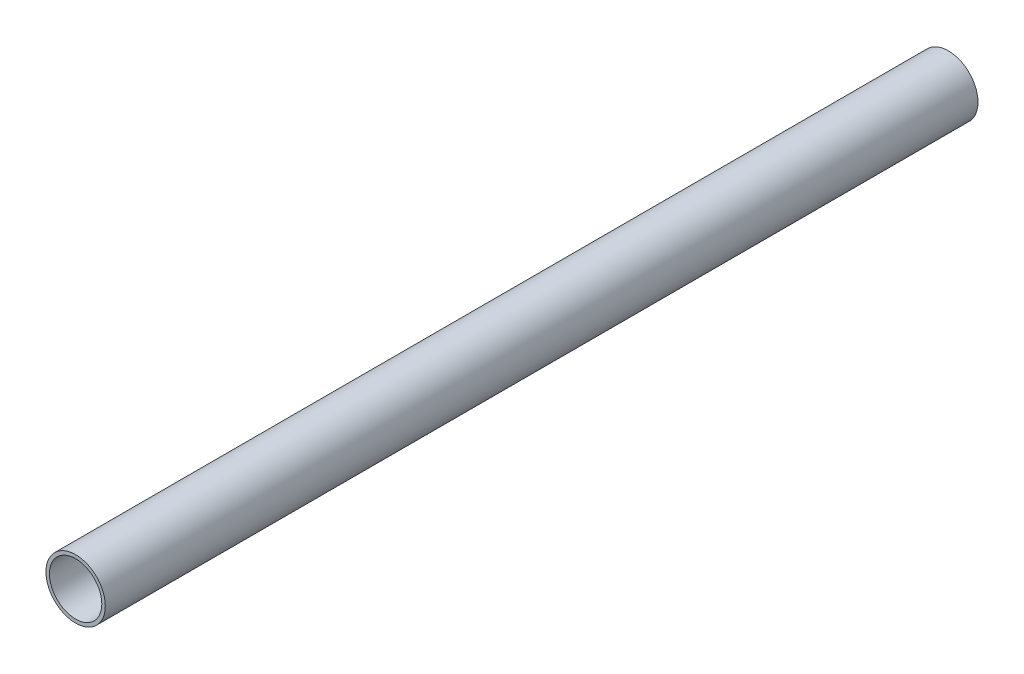
ISO-10303-21;
HEADER;
FILE_DESCRIPTION(('STEP AP214'),'2;1');
FILE_NAME('part.step','',(''),(''),'','','');
FILE_SCHEMA(('AUTOMOTIVE_DESIGN { 1 0 10303 214 1 1 1 1 }'));
ENDSEC;
DATA;
#1=APPLICATION_CONTEXT('core data for automotive mechanical design processes');
#2=APPLICATION_PROTOCOL_DEFINITION('international standard','automotive_design',2000,#1);
#3=PRODUCT_CONTEXT('',#1,'mechanical');
#4=PRODUCT('Part','Part','',(#3));
#5=PRODUCT_RELATED_PRODUCT_CATEGORY('part','',(#4));
#6=PRODUCT_DEFINITION_FORMATION('','',#4);
#7=PRODUCT_DEFINITION_CONTEXT('part definition',#1,'design');
#8=PRODUCT_DEFINITION('design','',#6,#7);
#9=PRODUCT_DEFINITION_SHAPE('','',#8);
#10=(LENGTH_UNIT() NAMED_UNIT(*) SI_UNIT(.MILLI.,.METRE.));
#11=(NAMED_UNIT(*) PLANE_ANGLE_UNIT() SI_UNIT($,.RADIAN.));
#12=(NAMED_UNIT(*) SI_UNIT($,.STERADIAN.) SOLID_ANGLE_UNIT());
#13=UNCERTAINTY_MEASURE_WITH_UNIT(LENGTH_MEASURE(1.E-05),#10,'distance_accuracy_value','');
#14=(GEOMETRIC_REPRESENTATION_CONTEXT(3) GLOBAL_UNCERTAINTY_ASSIGNED_CONTEXT((#13)) GLOBAL_UNIT_ASSIGNED_CONTEXT((#10,
#11,#12)) REPRESENTATION_CONTEXT('',''));
#15=CARTESIAN_POINT('',(0.,0.,0.));
#16=DIRECTION('',(0.,0.,1.));
#17=DIRECTION('',(1.,0.,0.));
#18=AXIS2_PLACEMENT_3D('',#15,#16,#17);
#19=CARTESIAN_POINT('',(0.,0.,500.));
#20=DIRECTION('',(0.,0.,1.));
#21=DIRECTION('',(1.,0.,0.));
#22=AXIS2_PLACEMENT_3D('',#19,#20,#21);
#23=PLANE('',#22);
#24=CARTESIAN_POINT('',(0.,0.,500.));
#25=DIRECTION('',(0.,0.,1.));
#26=DIRECTION('',(1.,0.,0.));
#27=AXIS2_PLACEMENT_3D('',#24,#25,#26);
#28=CIRCLE('',#27,17.);
#29=CARTESIAN_POINT('',(17.,0.,500.));
#30=VERTEX_POINT('',#29);
#31=EDGE_CURVE('E10',#30,#30,#28,.T.);
#32=ORIENTED_EDGE('',*,*,#31,.T.);
#33=EDGE_LOOP('',(#32));
#34=FACE_BOUND('',#33,.T.);
#35=CARTESIAN_POINT('',(0.,0.,500.));
#36=DIRECTION('',(0.,0.,1.));
#37=DIRECTION('',(1.,0.,0.));
#38=AXIS2_PLACEMENT_3D('',#35,#36,#37);
#39=CIRCLE('',#38,15.);
#40=CARTESIAN_POINT('',(15.,0.,500.));
#41=VERTEX_POINT('',#40);
#42=EDGE_CURVE('E52',#41,#41,#39,.T.);
#43=ORIENTED_EDGE('',*,*,#42,.F.);
#44=EDGE_LOOP('',(#43));
#45=FACE_BOUND('',#44,.T.);
#46=ADVANCED_FACE('F38',(#34,#45),#23,.T.);
#47=CARTESIAN_POINT('',(0.,0.,0.));
#48=DIRECTION('',(0.,0.,1.));
#49=DIRECTION('',(1.,0.,0.));
#50=AXIS2_PLACEMENT_3D('',#47,#48,#49);
#51=PLANE('',#50);
#52=CARTESIAN_POINT('',(0.,0.,0.));
#53=DIRECTION('',(0.,0.,1.));
#54=DIRECTION('',(1.,0.,0.));
#55=AXIS2_PLACEMENT_3D('',#52,#53,#54);
#56=CIRCLE('',#55,17.);
#57=CARTESIAN_POINT('',(17.,0.,0.));
#58=VERTEX_POINT('',#57);
#59=EDGE_CURVE('E42',#58,#58,#56,.T.);
#60=ORIENTED_EDGE('',*,*,#59,.F.);
#61=EDGE_LOOP('',(#60));
#62=FACE_BOUND('',#61,.T.);
#63=CARTESIAN_POINT('',(0.,0.,0.));
#64=DIRECTION('',(0.,0.,1.));
#65=DIRECTION('',(1.,0.,0.));
#66=AXIS2_PLACEMENT_3D('',#63,#64,#65);
#67=CIRCLE('',#66,15.);
#68=CARTESIAN_POINT('',(15.,0.,0.));
#69=VERTEX_POINT('',#68);
#70=EDGE_CURVE('E54',#69,#69,#67,.T.);
#71=ORIENTED_EDGE('',*,*,#70,.T.);
#72=EDGE_LOOP('',(#71));
#73=FACE_BOUND('',#72,.T.);
#74=ADVANCED_FACE('F67',(#62,#73),#51,.F.);
#75=CARTESIAN_POINT('',(0.,0.,500.));
#76=DIRECTION('',(0.,0.,-1.));
#77=DIRECTION('',(-1.,0.,0.));
#78=AXIS2_PLACEMENT_3D('',#75,#76,#77);
#79=CYLINDRICAL_SURFACE('',#78,17.);
#80=ORIENTED_EDGE('',*,*,#31,.F.);
#81=EDGE_LOOP('',(#80));
#82=FACE_BOUND('',#81,.T.);
#83=ORIENTED_EDGE('',*,*,#59,.T.);
#84=EDGE_LOOP('',(#83));
#85=FACE_BOUND('',#84,.T.);
#86=ADVANCED_FACE('F40',(#82,#85),#79,.T.);
#87=CARTESIAN_POINT('',(0.,0.,500.));
#88=DIRECTION('',(0.,0.,-1.));
#89=DIRECTION('',(-1.,0.,0.));
#90=AXIS2_PLACEMENT_3D('',#87,#88,#89);
#91=CYLINDRICAL_SURFACE('',#90,15.);
#92=ORIENTED_EDGE('',*,*,#42,.T.);
#93=EDGE_LOOP('',(#92));
#94=FACE_BOUND('',#93,.T.);
#95=ORIENTED_EDGE('',*,*,#70,.F.);
#96=EDGE_LOOP('',(#95));
#97=FACE_BOUND('',#96,.T.);
#98=ADVANCED_FACE('F63',(#94,#97),#91,.F.);
#99=CLOSED_SHELL('',(#46,#74,#86,#98));
#100=MANIFOLD_SOLID_BREP('B2',#99);
#101=ADVANCED_BREP_SHAPE_REPRESENTATION('',(#18,#100),#14);
#102=SHAPE_DEFINITION_REPRESENTATION(#9,#101);
ENDSEC;
END-ISO-10303-21;
